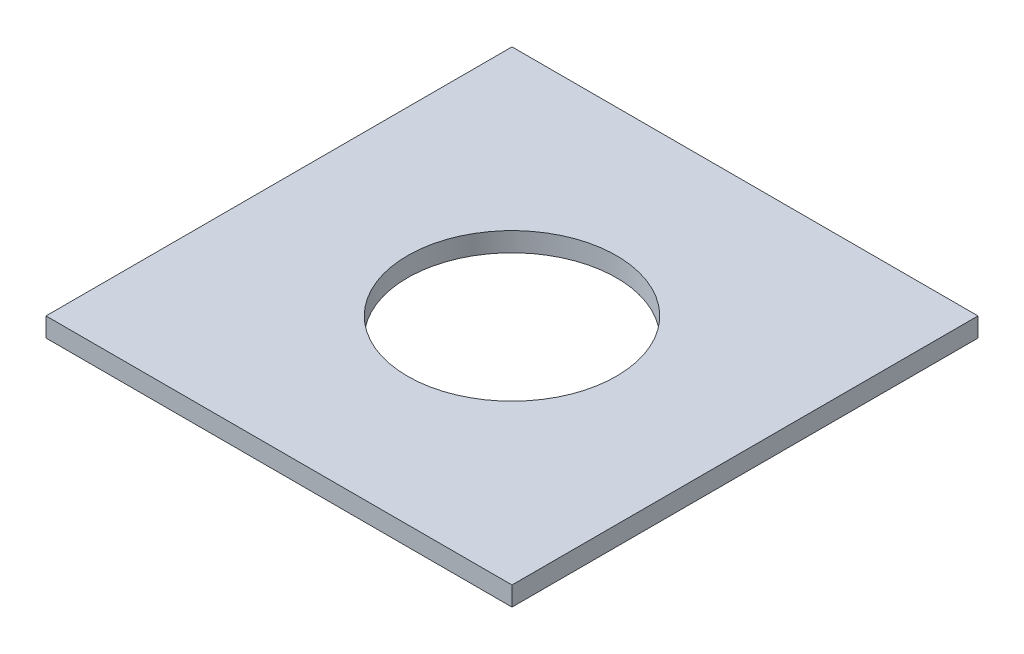
ISO-10303-21;
HEADER;
FILE_DESCRIPTION(('STEP AP214'),'2;1');
FILE_NAME('part.step','',(''),(''),'','','');
FILE_SCHEMA(('AUTOMOTIVE_DESIGN { 1 0 10303 214 1 1 1 1 }'));
ENDSEC;
DATA;
#1=APPLICATION_CONTEXT('core data for automotive mechanical design processes');
#2=APPLICATION_PROTOCOL_DEFINITION('international standard','automotive_design',2000,#1);
#3=PRODUCT_CONTEXT('',#1,'mechanical');
#4=PRODUCT('Part','Part','',(#3));
#5=PRODUCT_RELATED_PRODUCT_CATEGORY('part','',(#4));
#6=PRODUCT_DEFINITION_FORMATION('','',#4);
#7=PRODUCT_DEFINITION_CONTEXT('part definition',#1,'design');
#8=PRODUCT_DEFINITION('design','',#6,#7);
#9=PRODUCT_DEFINITION_SHAPE('','',#8);
#10=(LENGTH_UNIT() NAMED_UNIT(*) SI_UNIT(.MILLI.,.METRE.));
#11=(NAMED_UNIT(*) PLANE_ANGLE_UNIT() SI_UNIT($,.RADIAN.));
#12=(NAMED_UNIT(*) SI_UNIT($,.STERADIAN.) SOLID_ANGLE_UNIT());
#13=UNCERTAINTY_MEASURE_WITH_UNIT(LENGTH_MEASURE(1.E-05),#10,'distance_accuracy_value','');
#14=(GEOMETRIC_REPRESENTATION_CONTEXT(3) GLOBAL_UNCERTAINTY_ASSIGNED_CONTEXT((#13)) GLOBAL_UNIT_ASSIGNED_CONTEXT((#10,
#11,#12)) REPRESENTATION_CONTEXT('',''));
#15=CARTESIAN_POINT('',(0.,0.,0.));
#16=DIRECTION('',(0.,0.,1.));
#17=DIRECTION('',(1.,0.,0.));
#18=AXIS2_PLACEMENT_3D('',#15,#16,#17);
#19=CARTESIAN_POINT('',(0.,8.,0.));
#20=DIRECTION('',(0.,1.,0.));
#21=DIRECTION('',(0.,0.,1.));
#22=AXIS2_PLACEMENT_3D('',#19,#20,#21);
#23=PLANE('',#22);
#24=DIRECTION('',(0.,0.,1.));
#25=VECTOR('',#24,1.);
#26=CARTESIAN_POINT('',(-90.6666666666666,8.,-65.));
#27=LINE('',#26,#25);
#28=CARTESIAN_POINT('',(-90.6666666666666,8.,-65.));
#29=VERTEX_POINT('',#28);
#30=CARTESIAN_POINT('',(-90.6666666666666,8.,129.));
#31=VERTEX_POINT('',#30);
#32=EDGE_CURVE('E85',#29,#31,#27,.T.);
#33=ORIENTED_EDGE('',*,*,#32,.T.);
#34=DIRECTION('',(1.,0.,0.));
#35=VECTOR('',#34,1.);
#36=CARTESIAN_POINT('',(-90.6666666666666,8.,129.));
#37=LINE('',#36,#35);
#38=CARTESIAN_POINT('',(103.333333333333,8.,129.));
#39=VERTEX_POINT('',#38);
#40=EDGE_CURVE('E80',#31,#39,#37,.T.);
#41=ORIENTED_EDGE('',*,*,#40,.T.);
#42=DIRECTION('',(0.,0.,-1.));
#43=VECTOR('',#42,1.);
#44=CARTESIAN_POINT('',(103.333333333333,8.,-65.));
#45=LINE('',#44,#43);
#46=CARTESIAN_POINT('',(103.333333333333,8.,-65.));
#47=VERTEX_POINT('',#46);
#48=EDGE_CURVE('E83',#39,#47,#45,.T.);
#49=ORIENTED_EDGE('',*,*,#48,.T.);
#50=DIRECTION('',(-1.,0.,0.));
#51=VECTOR('',#50,1.);
#52=CARTESIAN_POINT('',(-90.6666666666666,8.,-65.));
#53=LINE('',#52,#51);
#54=EDGE_CURVE('E50',#47,#29,#53,.T.);
#55=ORIENTED_EDGE('',*,*,#54,.T.);
#56=EDGE_LOOP('',(#33,#41,#49,#55));
#57=FACE_BOUND('',#56,.T.);
#58=CARTESIAN_POINT('',(6.3333333333334,8.,32.));
#59=DIRECTION('',(0.,1.,0.));
#60=DIRECTION('',(0.,0.,1.));
#61=AXIS2_PLACEMENT_3D('',#58,#59,#60);
#62=CIRCLE('',#61,43.5);
#63=CARTESIAN_POINT('',(6.3333333333334,8.,75.5));
#64=VERTEX_POINT('',#63);
#65=EDGE_CURVE('E100',#64,#64,#62,.T.);
#66=ORIENTED_EDGE('',*,*,#65,.F.);
#67=EDGE_LOOP('',(#66));
#68=FACE_BOUND('',#67,.T.);
#69=ADVANCED_FACE('F33',(#57,#68),#23,.T.);
#70=CARTESIAN_POINT('',(0.,0.,0.));
#71=DIRECTION('',(0.,1.,0.));
#72=DIRECTION('',(0.,0.,1.));
#73=AXIS2_PLACEMENT_3D('',#70,#71,#72);
#74=PLANE('',#73);
#75=DIRECTION('',(0.,0.,1.));
#76=VECTOR('',#75,1.);
#77=CARTESIAN_POINT('',(-90.6666666666666,0.,-65.));
#78=LINE('',#77,#76);
#79=CARTESIAN_POINT('',(-90.6666666666666,0.,-65.));
#80=VERTEX_POINT('',#79);
#81=CARTESIAN_POINT('',(-90.6666666666666,0.,129.));
#82=VERTEX_POINT('',#81);
#83=EDGE_CURVE('E97',#80,#82,#78,.T.);
#84=ORIENTED_EDGE('',*,*,#83,.F.);
#85=DIRECTION('',(-1.,0.,0.));
#86=VECTOR('',#85,1.);
#87=CARTESIAN_POINT('',(-90.6666666666666,0.,-65.));
#88=LINE('',#87,#86);
#89=CARTESIAN_POINT('',(103.333333333333,0.,-65.));
#90=VERTEX_POINT('',#89);
#91=EDGE_CURVE('E73',#90,#80,#88,.T.);
#92=ORIENTED_EDGE('',*,*,#91,.F.);
#93=DIRECTION('',(0.,0.,-1.));
#94=VECTOR('',#93,1.);
#95=CARTESIAN_POINT('',(103.333333333333,0.,-65.));
#96=LINE('',#95,#94);
#97=CARTESIAN_POINT('',(103.333333333333,0.,129.));
#98=VERTEX_POINT('',#97);
#99=EDGE_CURVE('E67',#98,#90,#96,.T.);
#100=ORIENTED_EDGE('',*,*,#99,.F.);
#101=DIRECTION('',(1.,0.,0.));
#102=VECTOR('',#101,1.);
#103=CARTESIAN_POINT('',(-90.6666666666666,0.,129.));
#104=LINE('',#103,#102);
#105=EDGE_CURVE('E89',#82,#98,#104,.T.);
#106=ORIENTED_EDGE('',*,*,#105,.F.);
#107=EDGE_LOOP('',(#84,#92,#100,#106));
#108=FACE_BOUND('',#107,.T.);
#109=CARTESIAN_POINT('',(6.3333333333334,0.,32.));
#110=DIRECTION('',(0.,1.,0.));
#111=DIRECTION('',(0.,0.,1.));
#112=AXIS2_PLACEMENT_3D('',#109,#110,#111);
#113=CIRCLE('',#112,43.5);
#114=CARTESIAN_POINT('',(6.3333333333334,0.,75.5));
#115=VERTEX_POINT('',#114);
#116=EDGE_CURVE('E112',#115,#115,#113,.T.);
#117=ORIENTED_EDGE('',*,*,#116,.T.);
#118=EDGE_LOOP('',(#117));
#119=FACE_BOUND('',#118,.T.);
#120=ADVANCED_FACE('F108',(#108,#119),#74,.F.);
#121=CARTESIAN_POINT('',(-90.6666666666666,8.,-65.));
#122=DIRECTION('',(1.,0.,0.));
#123=DIRECTION('',(0.,0.,-1.));
#124=AXIS2_PLACEMENT_3D('',#121,#122,#123);
#125=PLANE('',#124);
#126=ORIENTED_EDGE('',*,*,#83,.T.);
#127=DIRECTION('',(0.,-1.,0.));
#128=VECTOR('',#127,1.);
#129=CARTESIAN_POINT('',(-90.6666666666666,8.,129.));
#130=LINE('',#129,#128);
#131=EDGE_CURVE('E11',#31,#82,#130,.T.);
#132=ORIENTED_EDGE('',*,*,#131,.F.);
#133=ORIENTED_EDGE('',*,*,#32,.F.);
#134=DIRECTION('',(0.,-1.,0.));
#135=VECTOR('',#134,1.);
#136=CARTESIAN_POINT('',(-90.6666666666666,8.,-65.));
#137=LINE('',#136,#135);
#138=EDGE_CURVE('E93',#29,#80,#137,.T.);
#139=ORIENTED_EDGE('',*,*,#138,.T.);
#140=EDGE_LOOP('',(#126,#132,#133,#139));
#141=FACE_BOUND('',#140,.T.);
#142=ADVANCED_FACE('F35',(#141),#125,.F.);
#143=CARTESIAN_POINT('',(-90.6666666666666,8.,129.));
#144=DIRECTION('',(0.,0.,-1.));
#145=DIRECTION('',(-1.,0.,0.));
#146=AXIS2_PLACEMENT_3D('',#143,#144,#145);
#147=PLANE('',#146);
#148=ORIENTED_EDGE('',*,*,#105,.T.);
#149=DIRECTION('',(0.,-1.,0.));
#150=VECTOR('',#149,1.);
#151=CARTESIAN_POINT('',(103.333333333333,8.,129.));
#152=LINE('',#151,#150);
#153=EDGE_CURVE('E42',#39,#98,#152,.T.);
#154=ORIENTED_EDGE('',*,*,#153,.F.);
#155=ORIENTED_EDGE('',*,*,#40,.F.);
#156=ORIENTED_EDGE('',*,*,#131,.T.);
#157=EDGE_LOOP('',(#148,#154,#155,#156));
#158=FACE_BOUND('',#157,.T.);
#159=ADVANCED_FACE('F88',(#158),#147,.F.);
#160=CARTESIAN_POINT('',(103.333333333333,8.,-65.));
#161=DIRECTION('',(-1.,0.,0.));
#162=DIRECTION('',(0.,0.,1.));
#163=AXIS2_PLACEMENT_3D('',#160,#161,#162);
#164=PLANE('',#163);
#165=ORIENTED_EDGE('',*,*,#99,.T.);
#166=DIRECTION('',(0.,-1.,0.));
#167=VECTOR('',#166,1.);
#168=CARTESIAN_POINT('',(103.333333333333,8.,-65.));
#169=LINE('',#168,#167);
#170=EDGE_CURVE('E90',#47,#90,#169,.T.);
#171=ORIENTED_EDGE('',*,*,#170,.F.);
#172=ORIENTED_EDGE('',*,*,#48,.F.);
#173=ORIENTED_EDGE('',*,*,#153,.T.);
#174=EDGE_LOOP('',(#165,#171,#172,#173));
#175=FACE_BOUND('',#174,.T.);
#176=ADVANCED_FACE('F91',(#175),#164,.F.);
#177=CARTESIAN_POINT('',(-90.6666666666666,8.,-65.));
#178=DIRECTION('',(0.,0.,1.));
#179=DIRECTION('',(1.,0.,0.));
#180=AXIS2_PLACEMENT_3D('',#177,#178,#179);
#181=PLANE('',#180);
#182=ORIENTED_EDGE('',*,*,#91,.T.);
#183=ORIENTED_EDGE('',*,*,#138,.F.);
#184=ORIENTED_EDGE('',*,*,#54,.F.);
#185=ORIENTED_EDGE('',*,*,#170,.T.);
#186=EDGE_LOOP('',(#182,#183,#184,#185));
#187=FACE_BOUND('',#186,.T.);
#188=ADVANCED_FACE('F105',(#187),#181,.F.);
#189=CARTESIAN_POINT('',(6.3333333333334,8.,32.));
#190=DIRECTION('',(0.,-1.,0.));
#191=DIRECTION('',(0.,0.,-1.));
#192=AXIS2_PLACEMENT_3D('',#189,#190,#191);
#193=CYLINDRICAL_SURFACE('',#192,43.5);
#194=ORIENTED_EDGE('',*,*,#65,.T.);
#195=EDGE_LOOP('',(#194));
#196=FACE_BOUND('',#195,.T.);
#197=ORIENTED_EDGE('',*,*,#116,.F.);
#198=EDGE_LOOP('',(#197));
#199=FACE_BOUND('',#198,.T.);
#200=ADVANCED_FACE('F118',(#196,#199),#193,.F.);
#201=CLOSED_SHELL('',(#69,#120,#142,#159,#176,#188,#200));
#202=MANIFOLD_SOLID_BREP('B2',#201);
#203=ADVANCED_BREP_SHAPE_REPRESENTATION('',(#18,#202),#14);
#204=SHAPE_DEFINITION_REPRESENTATION(#9,#203);
ENDSEC;
END-ISO-10303-21;
